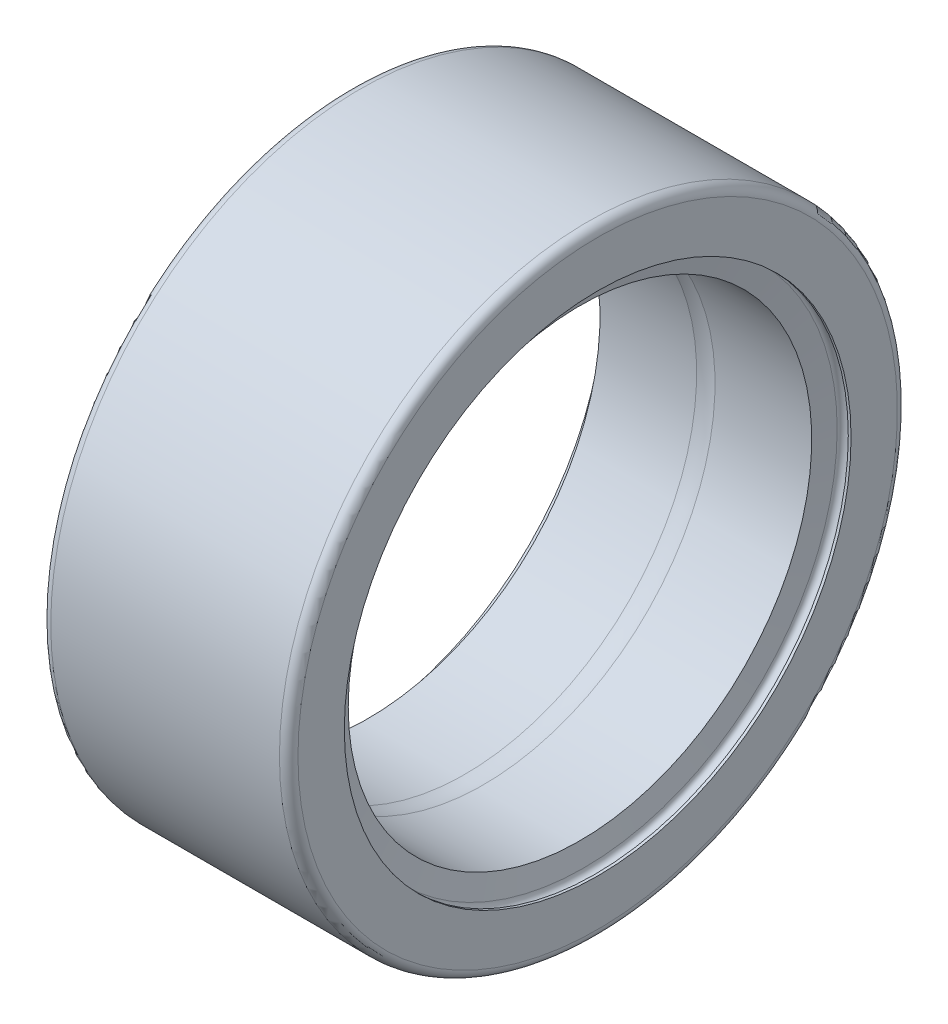
ISO-10303-21;
HEADER;
FILE_DESCRIPTION(('STEP AP214'),'2;1');
FILE_NAME('part.step','',(''),(''),'','','');
FILE_SCHEMA(('AUTOMOTIVE_DESIGN { 1 0 10303 214 1 1 1 1 }'));
ENDSEC;
DATA;
#1=APPLICATION_CONTEXT('core data for automotive mechanical design processes');
#2=APPLICATION_PROTOCOL_DEFINITION('international standard','automotive_design',2000,#1);
#3=PRODUCT_CONTEXT('',#1,'mechanical');
#4=PRODUCT('Part','Part','',(#3));
#5=PRODUCT_RELATED_PRODUCT_CATEGORY('part','',(#4));
#6=PRODUCT_DEFINITION_FORMATION('','',#4);
#7=PRODUCT_DEFINITION_CONTEXT('part definition',#1,'design');
#8=PRODUCT_DEFINITION('design','',#6,#7);
#9=PRODUCT_DEFINITION_SHAPE('','',#8);
#10=(LENGTH_UNIT() NAMED_UNIT(*) SI_UNIT(.MILLI.,.METRE.));
#11=(NAMED_UNIT(*) PLANE_ANGLE_UNIT() SI_UNIT($,.RADIAN.));
#12=(NAMED_UNIT(*) SI_UNIT($,.STERADIAN.) SOLID_ANGLE_UNIT());
#13=UNCERTAINTY_MEASURE_WITH_UNIT(LENGTH_MEASURE(1.E-05),#10,'distance_accuracy_value','');
#14=(GEOMETRIC_REPRESENTATION_CONTEXT(3) GLOBAL_UNCERTAINTY_ASSIGNED_CONTEXT((#13)) GLOBAL_UNIT_ASSIGNED_CONTEXT((#10,
#11,#12)) REPRESENTATION_CONTEXT('',''));
#15=CARTESIAN_POINT('',(0.,0.,0.));
#16=DIRECTION('',(0.,0.,1.));
#17=DIRECTION('',(1.,0.,0.));
#18=AXIS2_PLACEMENT_3D('',#15,#16,#17);
#19=CARTESIAN_POINT('',(0.,4.85,0.));
#20=DIRECTION('',(1.,0.,0.));
#21=DIRECTION('',(0.,0.,-1.));
#22=AXIS2_PLACEMENT_3D('',#19,#20,#21);
#23=PLANE('',#22);
#24=CARTESIAN_POINT('',(0.,0.,0.));
#25=DIRECTION('',(-1.,0.,0.));
#26=DIRECTION('',(0.,0.,1.));
#27=AXIS2_PLACEMENT_3D('',#24,#25,#26);
#28=CIRCLE('',#27,4.1);
#29=CARTESIAN_POINT('',(0.,0.,4.1));
#30=VERTEX_POINT('',#29);
#31=EDGE_CURVE('E85',#30,#30,#28,.T.);
#32=ORIENTED_EDGE('',*,*,#31,.F.);
#33=EDGE_LOOP('',(#32));
#34=FACE_BOUND('',#33,.T.);
#35=CARTESIAN_POINT('',(0.,0.,0.));
#36=DIRECTION('',(-1.,0.,0.));
#37=DIRECTION('',(0.,0.,1.));
#38=AXIS2_PLACEMENT_3D('',#35,#36,#37);
#39=CIRCLE('',#38,4.85);
#40=CARTESIAN_POINT('',(0.,0.,4.85));
#41=VERTEX_POINT('',#40);
#42=EDGE_CURVE('E10',#41,#41,#39,.T.);
#43=ORIENTED_EDGE('',*,*,#42,.T.);
#44=EDGE_LOOP('',(#43));
#45=FACE_BOUND('',#44,.T.);
#46=ADVANCED_FACE('F39',(#34,#45),#23,.F.);
#47=CARTESIAN_POINT('',(0.14999999999997,0.,0.));
#48=DIRECTION('',(-1.,0.,0.));
#49=DIRECTION('',(0.,0.,1.));
#50=AXIS2_PLACEMENT_3D('',#47,#48,#49);
#51=TOROIDAL_SURFACE('',#50,4.85000000000003,0.14999999999997);
#52=ORIENTED_EDGE('',*,*,#42,.F.);
#53=EDGE_LOOP('',(#52));
#54=FACE_BOUND('',#53,.T.);
#55=CARTESIAN_POINT('',(0.149999999999997,0.,0.));
#56=DIRECTION('',(-1.,0.,0.));
#57=DIRECTION('',(0.,0.,1.));
#58=AXIS2_PLACEMENT_3D('',#55,#56,#57);
#59=CIRCLE('',#58,5.);
#60=CARTESIAN_POINT('',(0.149999999999997,0.,5.));
#61=VERTEX_POINT('',#60);
#62=EDGE_CURVE('E45',#61,#61,#59,.T.);
#63=ORIENTED_EDGE('',*,*,#62,.T.);
#64=EDGE_LOOP('',(#63));
#65=FACE_BOUND('',#64,.T.);
#66=ADVANCED_FACE('F92',(#54,#65),#51,.T.);
#67=CARTESIAN_POINT('',(50.,0.,0.));
#68=DIRECTION('',(-1.,0.,0.));
#69=DIRECTION('',(0.,0.,1.));
#70=AXIS2_PLACEMENT_3D('',#67,#68,#69);
#71=CYLINDRICAL_SURFACE('',#70,5.);
#72=ORIENTED_EDGE('',*,*,#62,.F.);
#73=EDGE_LOOP('',(#72));
#74=FACE_BOUND('',#73,.T.);
#75=CARTESIAN_POINT('',(3.85,0.,0.));
#76=DIRECTION('',(-1.,0.,0.));
#77=DIRECTION('',(0.,0.,1.));
#78=AXIS2_PLACEMENT_3D('',#75,#76,#77);
#79=CIRCLE('',#78,5.);
#80=CARTESIAN_POINT('',(3.85,0.,5.));
#81=VERTEX_POINT('',#80);
#82=EDGE_CURVE('E49',#81,#81,#79,.T.);
#83=ORIENTED_EDGE('',*,*,#82,.T.);
#84=EDGE_LOOP('',(#83));
#85=FACE_BOUND('',#84,.T.);
#86=ADVANCED_FACE('F96',(#74,#85),#71,.T.);
#87=CARTESIAN_POINT('',(3.85000000000006,0.,0.));
#88=DIRECTION('',(-1.,0.,0.));
#89=DIRECTION('',(0.,0.,1.));
#90=AXIS2_PLACEMENT_3D('',#87,#88,#89);
#91=TOROIDAL_SURFACE('',#90,4.85000000000006,0.14999999999994);
#92=ORIENTED_EDGE('',*,*,#82,.F.);
#93=EDGE_LOOP('',(#92));
#94=FACE_BOUND('',#93,.T.);
#95=CARTESIAN_POINT('',(4.,0.,0.));
#96=DIRECTION('',(-1.,0.,0.));
#97=DIRECTION('',(0.,0.,1.));
#98=AXIS2_PLACEMENT_3D('',#95,#96,#97);
#99=CIRCLE('',#98,4.85);
#100=CARTESIAN_POINT('',(4.,0.,4.85));
#101=VERTEX_POINT('',#100);
#102=EDGE_CURVE('E53',#101,#101,#99,.T.);
#103=ORIENTED_EDGE('',*,*,#102,.T.);
#104=EDGE_LOOP('',(#103));
#105=FACE_BOUND('',#104,.T.);
#106=ADVANCED_FACE('F101',(#94,#105),#91,.T.);
#107=CARTESIAN_POINT('',(4.,4.1,0.));
#108=DIRECTION('',(-1.,0.,0.));
#109=DIRECTION('',(0.,0.,1.));
#110=AXIS2_PLACEMENT_3D('',#107,#108,#109);
#111=PLANE('',#110);
#112=ORIENTED_EDGE('',*,*,#102,.F.);
#113=EDGE_LOOP('',(#112));
#114=FACE_BOUND('',#113,.T.);
#115=CARTESIAN_POINT('',(4.,0.,0.));
#116=DIRECTION('',(-1.,0.,0.));
#117=DIRECTION('',(0.,0.,1.));
#118=AXIS2_PLACEMENT_3D('',#115,#116,#117);
#119=CIRCLE('',#118,4.1);
#120=CARTESIAN_POINT('',(4.,0.,4.1));
#121=VERTEX_POINT('',#120);
#122=EDGE_CURVE('E58',#121,#121,#119,.T.);
#123=ORIENTED_EDGE('',*,*,#122,.T.);
#124=EDGE_LOOP('',(#123));
#125=FACE_BOUND('',#124,.T.);
#126=ADVANCED_FACE('F107',(#114,#125),#111,.F.);
#127=CARTESIAN_POINT('',(50.,0.,0.));
#128=DIRECTION('',(-1.,0.,0.));
#129=DIRECTION('',(0.,0.,1.));
#130=AXIS2_PLACEMENT_3D('',#127,#128,#129);
#131=CYLINDRICAL_SURFACE('',#130,4.1);
#132=ORIENTED_EDGE('',*,*,#122,.F.);
#133=EDGE_LOOP('',(#132));
#134=FACE_BOUND('',#133,.T.);
#135=CARTESIAN_POINT('',(3.955,0.,0.));
#136=DIRECTION('',(-1.,0.,0.));
#137=DIRECTION('',(0.,0.,1.));
#138=AXIS2_PLACEMENT_3D('',#135,#136,#137);
#139=CIRCLE('',#138,4.1);
#140=CARTESIAN_POINT('',(3.955,0.,4.1));
#141=VERTEX_POINT('',#140);
#142=EDGE_CURVE('E61',#141,#141,#139,.T.);
#143=ORIENTED_EDGE('',*,*,#142,.T.);
#144=EDGE_LOOP('',(#143));
#145=FACE_BOUND('',#144,.T.);
#146=ADVANCED_FACE('F111',(#134,#145),#131,.F.);
#147=CARTESIAN_POINT('',(3.865,0.,0.));
#148=DIRECTION('',(-1.,0.,0.));
#149=DIRECTION('',(0.,0.,1.));
#150=AXIS2_PLACEMENT_3D('',#147,#148,#149);
#151=TOROIDAL_SURFACE('',#150,4.1000000047488,0.0900000000000001);
#152=ORIENTED_EDGE('',*,*,#142,.F.);
#153=EDGE_LOOP('',(#152));
#154=FACE_BOUND('',#153,.T.);
#155=CARTESIAN_POINT('',(3.775,0.,0.));
#156=DIRECTION('',(-1.,0.,0.));
#157=DIRECTION('',(0.,0.,1.));
#158=AXIS2_PLACEMENT_3D('',#155,#156,#157);
#159=CIRCLE('',#158,4.1);
#160=CARTESIAN_POINT('',(3.775,0.,4.1));
#161=VERTEX_POINT('',#160);
#162=EDGE_CURVE('E64',#161,#161,#159,.T.);
#163=ORIENTED_EDGE('',*,*,#162,.T.);
#164=EDGE_LOOP('',(#163));
#165=FACE_BOUND('',#164,.T.);
#166=ADVANCED_FACE('F115',(#154,#165),#151,.F.);
#167=CARTESIAN_POINT('',(3.713285556752,0.,0.));
#168=DIRECTION('',(1.,0.,0.));
#169=DIRECTION('',(0.,0.,-1.));
#170=AXIS2_PLACEMENT_3D('',#167,#168,#169);
#171=CONICAL_SURFACE('',#170,3.75,1.39626340159537);
#172=ORIENTED_EDGE('',*,*,#162,.F.);
#173=EDGE_LOOP('',(#172));
#174=FACE_BOUND('',#173,.T.);
#175=CARTESIAN_POINT('',(3.713285556752,0.,0.));
#176=DIRECTION('',(-1.,0.,0.));
#177=DIRECTION('',(0.,0.,1.));
#178=AXIS2_PLACEMENT_3D('',#175,#176,#177);
#179=CIRCLE('',#178,3.75);
#180=CARTESIAN_POINT('',(3.713285556752,0.,3.75));
#181=VERTEX_POINT('',#180);
#182=EDGE_CURVE('E67',#181,#181,#179,.T.);
#183=ORIENTED_EDGE('',*,*,#182,.T.);
#184=EDGE_LOOP('',(#183));
#185=FACE_BOUND('',#184,.T.);
#186=ADVANCED_FACE('F119',(#174,#185),#171,.F.);
#187=CARTESIAN_POINT('',(50.,0.,0.));
#188=DIRECTION('',(-1.,0.,0.));
#189=DIRECTION('',(0.,0.,1.));
#190=AXIS2_PLACEMENT_3D('',#187,#188,#189);
#191=CYLINDRICAL_SURFACE('',#190,3.75);
#192=ORIENTED_EDGE('',*,*,#182,.F.);
#193=EDGE_LOOP('',(#192));
#194=FACE_BOUND('',#193,.T.);
#195=CARTESIAN_POINT('',(2.1484452761121,0.,0.));
#196=DIRECTION('',(-1.,0.,0.));
#197=DIRECTION('',(0.,0.,1.));
#198=AXIS2_PLACEMENT_3D('',#195,#196,#197);
#199=CIRCLE('',#198,3.75);
#200=CARTESIAN_POINT('',(2.1484452761121,0.,3.75));
#201=VERTEX_POINT('',#200);
#202=EDGE_CURVE('E70',#201,#201,#199,.T.);
#203=ORIENTED_EDGE('',*,*,#202,.T.);
#204=EDGE_LOOP('',(#203));
#205=FACE_BOUND('',#204,.T.);
#206=ADVANCED_FACE('F123',(#194,#205),#191,.F.);
#207=CARTESIAN_POINT('',(2.,0.,0.));
#208=DIRECTION('',(-1.,0.,0.));
#209=DIRECTION('',(0.,0.,1.));
#210=AXIS2_PLACEMENT_3D('',#207,#208,#209);
#211=TOROIDAL_SURFACE('',#210,2.97000000000009,0.793999999999913);
#212=ORIENTED_EDGE('',*,*,#202,.F.);
#213=EDGE_LOOP('',(#212));
#214=FACE_BOUND('',#213,.T.);
#215=CARTESIAN_POINT('',(1.8515547238879,0.,0.));
#216=DIRECTION('',(-1.,0.,0.));
#217=DIRECTION('',(0.,0.,1.));
#218=AXIS2_PLACEMENT_3D('',#215,#216,#217);
#219=CIRCLE('',#218,3.75);
#220=CARTESIAN_POINT('',(1.8515547238879,0.,3.75));
#221=VERTEX_POINT('',#220);
#222=EDGE_CURVE('E73',#221,#221,#219,.T.);
#223=ORIENTED_EDGE('',*,*,#222,.T.);
#224=EDGE_LOOP('',(#223));
#225=FACE_BOUND('',#224,.T.);
#226=ADVANCED_FACE('F127',(#214,#225),#211,.F.);
#227=CARTESIAN_POINT('',(50.,0.,0.));
#228=DIRECTION('',(-1.,0.,0.));
#229=DIRECTION('',(0.,0.,1.));
#230=AXIS2_PLACEMENT_3D('',#227,#228,#229);
#231=CYLINDRICAL_SURFACE('',#230,3.75);
#232=ORIENTED_EDGE('',*,*,#222,.F.);
#233=EDGE_LOOP('',(#232));
#234=FACE_BOUND('',#233,.T.);
#235=CARTESIAN_POINT('',(0.28671444324796,0.,0.));
#236=DIRECTION('',(-1.,0.,0.));
#237=DIRECTION('',(0.,0.,1.));
#238=AXIS2_PLACEMENT_3D('',#235,#236,#237);
#239=CIRCLE('',#238,3.75);
#240=CARTESIAN_POINT('',(0.28671444324796,0.,3.75));
#241=VERTEX_POINT('',#240);
#242=EDGE_CURVE('E76',#241,#241,#239,.T.);
#243=ORIENTED_EDGE('',*,*,#242,.T.);
#244=EDGE_LOOP('',(#243));
#245=FACE_BOUND('',#244,.T.);
#246=ADVANCED_FACE('F131',(#234,#245),#231,.F.);
#247=CARTESIAN_POINT('',(0.225000000000003,0.,0.));
#248=DIRECTION('',(-1.,0.,0.));
#249=DIRECTION('',(0.,0.,1.));
#250=AXIS2_PLACEMENT_3D('',#247,#248,#249);
#251=CONICAL_SURFACE('',#250,4.1,1.39626340159548);
#252=ORIENTED_EDGE('',*,*,#242,.F.);
#253=EDGE_LOOP('',(#252));
#254=FACE_BOUND('',#253,.T.);
#255=CARTESIAN_POINT('',(0.225000000000003,0.,0.));
#256=DIRECTION('',(-1.,0.,0.));
#257=DIRECTION('',(0.,0.,1.));
#258=AXIS2_PLACEMENT_3D('',#255,#256,#257);
#259=CIRCLE('',#258,4.1);
#260=CARTESIAN_POINT('',(0.225000000000003,0.,4.1));
#261=VERTEX_POINT('',#260);
#262=EDGE_CURVE('E79',#261,#261,#259,.T.);
#263=ORIENTED_EDGE('',*,*,#262,.T.);
#264=EDGE_LOOP('',(#263));
#265=FACE_BOUND('',#264,.T.);
#266=ADVANCED_FACE('F135',(#254,#265),#251,.F.);
#267=CARTESIAN_POINT('',(0.135,0.,0.));
#268=DIRECTION('',(-1.,0.,0.));
#269=DIRECTION('',(0.,0.,1.));
#270=AXIS2_PLACEMENT_3D('',#267,#268,#269);
#271=TOROIDAL_SURFACE('',#270,4.1,0.09);
#272=ORIENTED_EDGE('',*,*,#262,.F.);
#273=EDGE_LOOP('',(#272));
#274=FACE_BOUND('',#273,.T.);
#275=CARTESIAN_POINT('',(0.0450000000000034,0.,0.));
#276=DIRECTION('',(-1.,0.,0.));
#277=DIRECTION('',(0.,0.,1.));
#278=AXIS2_PLACEMENT_3D('',#275,#276,#277);
#279=CIRCLE('',#278,4.1);
#280=CARTESIAN_POINT('',(0.0450000000000034,0.,4.1));
#281=VERTEX_POINT('',#280);
#282=EDGE_CURVE('E82',#281,#281,#279,.T.);
#283=ORIENTED_EDGE('',*,*,#282,.T.);
#284=EDGE_LOOP('',(#283));
#285=FACE_BOUND('',#284,.T.);
#286=ADVANCED_FACE('F139',(#274,#285),#271,.F.);
#287=CARTESIAN_POINT('',(50.,0.,0.));
#288=DIRECTION('',(-1.,0.,0.));
#289=DIRECTION('',(0.,0.,1.));
#290=AXIS2_PLACEMENT_3D('',#287,#288,#289);
#291=CYLINDRICAL_SURFACE('',#290,4.1);
#292=ORIENTED_EDGE('',*,*,#282,.F.);
#293=EDGE_LOOP('',(#292));
#294=FACE_BOUND('',#293,.T.);
#295=ORIENTED_EDGE('',*,*,#31,.T.);
#296=EDGE_LOOP('',(#295));
#297=FACE_BOUND('',#296,.T.);
#298=ADVANCED_FACE('F89',(#294,#297),#291,.F.);
#299=CLOSED_SHELL('',(#46,#66,#86,#106,#126,#146,#166,#186,#206,#226,#246,#266,#286,#298));
#300=MANIFOLD_SOLID_BREP('B2',#299);
#301=ADVANCED_BREP_SHAPE_REPRESENTATION('',(#18,#300),#14);
#302=SHAPE_DEFINITION_REPRESENTATION(#9,#301);
ENDSEC;
END-ISO-10303-21;
